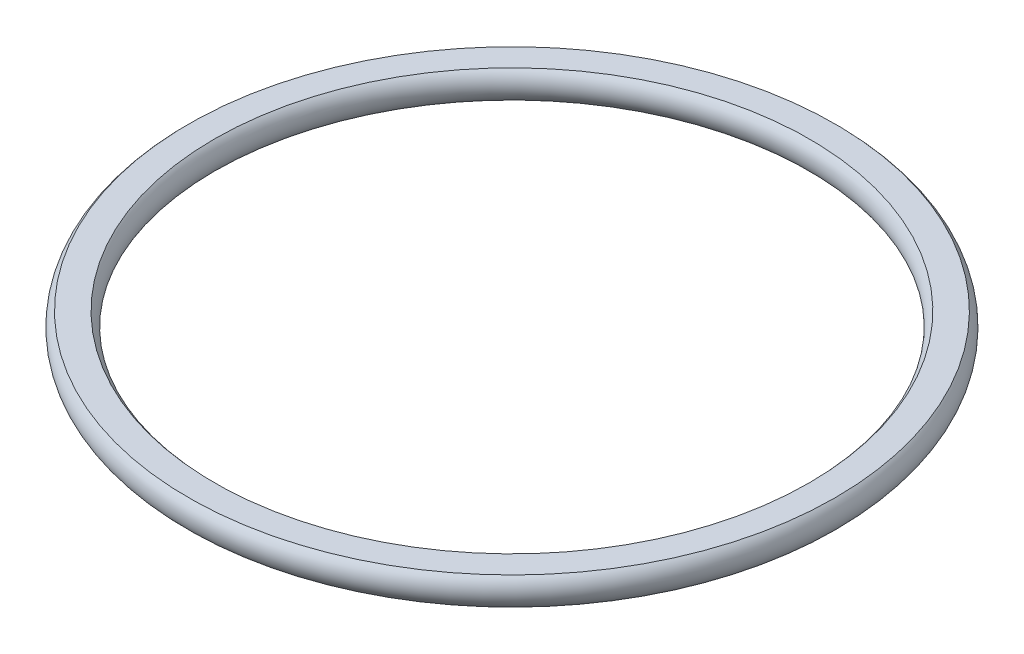
ISO-10303-21;
HEADER;
FILE_DESCRIPTION(('STEP AP214'),'2;1');
FILE_NAME('part.step','',(''),(''),'','','');
FILE_SCHEMA(('AUTOMOTIVE_DESIGN { 1 0 10303 214 1 1 1 1 }'));
ENDSEC;
DATA;
#1=APPLICATION_CONTEXT('core data for automotive mechanical design processes');
#2=APPLICATION_PROTOCOL_DEFINITION('international standard','automotive_design',2000,#1);
#3=PRODUCT_CONTEXT('',#1,'mechanical');
#4=PRODUCT('Part','Part','',(#3));
#5=PRODUCT_RELATED_PRODUCT_CATEGORY('part','',(#4));
#6=PRODUCT_DEFINITION_FORMATION('','',#4);
#7=PRODUCT_DEFINITION_CONTEXT('part definition',#1,'design');
#8=PRODUCT_DEFINITION('design','',#6,#7);
#9=PRODUCT_DEFINITION_SHAPE('','',#8);
#10=(LENGTH_UNIT() NAMED_UNIT(*) SI_UNIT(.MILLI.,.METRE.));
#11=(NAMED_UNIT(*) PLANE_ANGLE_UNIT() SI_UNIT($,.RADIAN.));
#12=(NAMED_UNIT(*) SI_UNIT($,.STERADIAN.) SOLID_ANGLE_UNIT());
#13=UNCERTAINTY_MEASURE_WITH_UNIT(LENGTH_MEASURE(1.E-05),#10,'distance_accuracy_value','');
#14=(GEOMETRIC_REPRESENTATION_CONTEXT(3) GLOBAL_UNCERTAINTY_ASSIGNED_CONTEXT((#13)) GLOBAL_UNIT_ASSIGNED_CONTEXT((#10,
#11,#12)) REPRESENTATION_CONTEXT('',''));
#15=CARTESIAN_POINT('',(0.,0.,0.));
#16=DIRECTION('',(0.,0.,1.));
#17=DIRECTION('',(1.,0.,0.));
#18=AXIS2_PLACEMENT_3D('',#15,#16,#17);
#19=CARTESIAN_POINT('',(12.25,-0.55,0.));
#20=DIRECTION('',(0.,-1.,0.));
#21=DIRECTION('',(0.,0.,-1.));
#22=AXIS2_PLACEMENT_3D('',#19,#20,#21);
#23=PLANE('',#22);
#24=CARTESIAN_POINT('',(12.25,-0.55,0.));
#25=DIRECTION('',(0.,-1.,0.));
#26=DIRECTION('',(-1.,0.,0.));
#27=AXIS2_PLACEMENT_3D('',#24,#25,#26);
#28=CIRCLE('',#27,11.74009804864);
#29=CARTESIAN_POINT('',(23.99009804864,-0.55,0.));
#30=VERTEX_POINT('',#29);
#31=EDGE_CURVE('E11',#30,#30,#28,.T.);
#32=ORIENTED_EDGE('',*,*,#31,.F.);
#33=EDGE_LOOP('',(#32));
#34=FACE_BOUND('',#33,.T.);
#35=CARTESIAN_POINT('',(12.25,-0.55,0.));
#36=DIRECTION('',(0.,1.,0.));
#37=DIRECTION('',(-1.,0.,0.));
#38=AXIS2_PLACEMENT_3D('',#35,#36,#37);
#39=CIRCLE('',#38,12.75990195136);
#40=CARTESIAN_POINT('',(25.00990195136,-0.55,0.));
#41=VERTEX_POINT('',#40);
#42=EDGE_CURVE('E21',#41,#41,#39,.T.);
#43=ORIENTED_EDGE('',*,*,#42,.F.);
#44=EDGE_LOOP('',(#43));
#45=FACE_BOUND('',#44,.T.);
#46=ADVANCED_FACE('F17',(#34,#45),#23,.T.);
#47=CARTESIAN_POINT('',(12.25,0.,0.));
#48=DIRECTION('',(0.,-1.,0.));
#49=DIRECTION('',(-1.,0.,0.));
#50=AXIS2_PLACEMENT_3D('',#47,#48,#49);
#51=TOROIDAL_SURFACE('',#50,12.25,0.75);
#52=CARTESIAN_POINT('',(12.25,0.55,0.));
#53=DIRECTION('',(0.,-1.,0.));
#54=DIRECTION('',(-1.,0.,0.));
#55=AXIS2_PLACEMENT_3D('',#52,#53,#54);
#56=CIRCLE('',#55,11.74009804864);
#57=CARTESIAN_POINT('',(23.99009804864,0.55,0.));
#58=VERTEX_POINT('',#57);
#59=EDGE_CURVE('E64',#58,#58,#56,.T.);
#60=ORIENTED_EDGE('',*,*,#59,.F.);
#61=CARTESIAN_POINT('',(24.5,0.,0.));
#62=DIRECTION('',(0.,0.,1.));
#63=DIRECTION('',(1.,0.,0.));
#64=AXIS2_PLACEMENT_3D('',#61,#62,#63);
#65=CIRCLE('',#64,0.75);
#66=EDGE_CURVE('E28',#58,#30,#65,.T.);
#67=ORIENTED_EDGE('',*,*,#66,.T.);
#68=ORIENTED_EDGE('',*,*,#31,.T.);
#69=ORIENTED_EDGE('',*,*,#66,.F.);
#70=EDGE_LOOP('',(#60,#67,#68,#69));
#71=FACE_BOUND('',#70,.T.);
#72=ADVANCED_FACE('F19',(#71),#51,.T.);
#73=CARTESIAN_POINT('',(12.25,0.55,0.));
#74=DIRECTION('',(0.,-1.,0.));
#75=DIRECTION('',(0.,0.,-1.));
#76=AXIS2_PLACEMENT_3D('',#73,#74,#75);
#77=PLANE('',#76);
#78=ORIENTED_EDGE('',*,*,#59,.T.);
#79=EDGE_LOOP('',(#78));
#80=FACE_BOUND('',#79,.T.);
#81=CARTESIAN_POINT('',(12.25,0.55,0.));
#82=DIRECTION('',(0.,-1.,0.));
#83=DIRECTION('',(-1.,0.,0.));
#84=AXIS2_PLACEMENT_3D('',#81,#82,#83);
#85=CIRCLE('',#84,12.75990195136);
#86=CARTESIAN_POINT('',(25.00990195136,0.55,0.));
#87=VERTEX_POINT('',#86);
#88=EDGE_CURVE('E49',#87,#87,#85,.T.);
#89=ORIENTED_EDGE('',*,*,#88,.F.);
#90=EDGE_LOOP('',(#89));
#91=FACE_BOUND('',#90,.T.);
#92=ADVANCED_FACE('F75',(#80,#91),#77,.F.);
#93=CARTESIAN_POINT('',(12.25,0.,0.));
#94=DIRECTION('',(0.,-1.,0.));
#95=DIRECTION('',(-1.,0.,0.));
#96=AXIS2_PLACEMENT_3D('',#93,#94,#95);
#97=TOROIDAL_SURFACE('',#96,12.25,0.75);
#98=ORIENTED_EDGE('',*,*,#42,.T.);
#99=CARTESIAN_POINT('',(24.5,0.,0.));
#100=DIRECTION('',(0.,0.,1.));
#101=DIRECTION('',(1.,0.,0.));
#102=AXIS2_PLACEMENT_3D('',#99,#100,#101);
#103=CIRCLE('',#102,0.75);
#104=EDGE_CURVE('E54',#41,#87,#103,.T.);
#105=ORIENTED_EDGE('',*,*,#104,.T.);
#106=ORIENTED_EDGE('',*,*,#88,.T.);
#107=ORIENTED_EDGE('',*,*,#104,.F.);
#108=EDGE_LOOP('',(#98,#105,#106,#107));
#109=FACE_BOUND('',#108,.T.);
#110=ADVANCED_FACE('F55',(#109),#97,.T.);
#111=CLOSED_SHELL('',(#46,#72,#92,#110));
#112=MANIFOLD_SOLID_BREP('B1',#111);
#113=ADVANCED_BREP_SHAPE_REPRESENTATION('',(#18,#112),#14);
#114=SHAPE_DEFINITION_REPRESENTATION(#9,#113);
ENDSEC;
END-ISO-10303-21;
